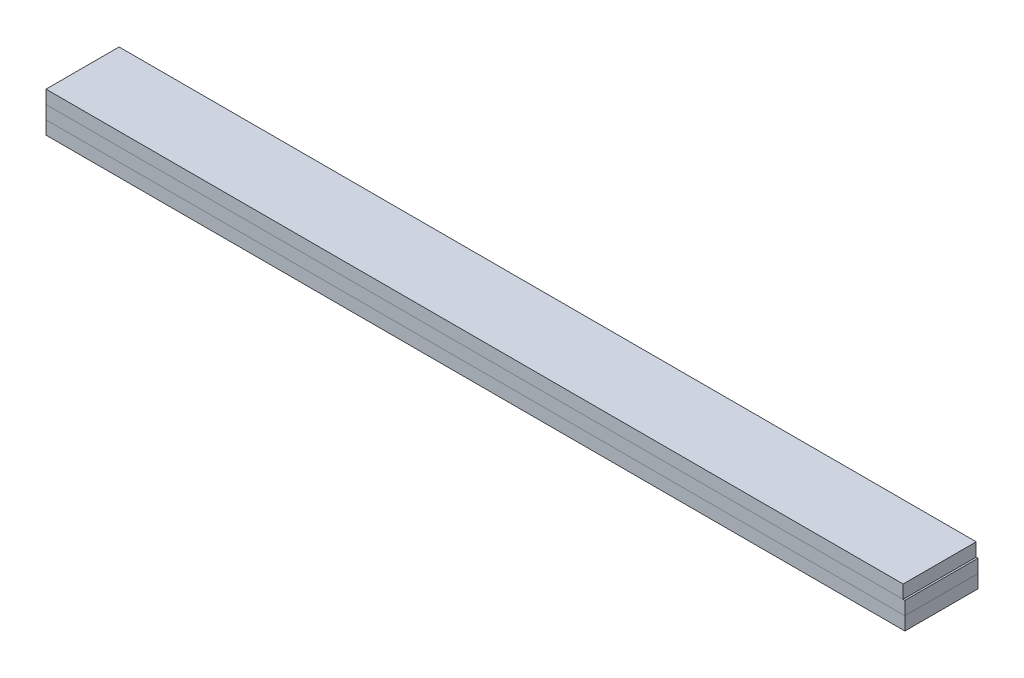
ISO-10303-21;
HEADER;
FILE_DESCRIPTION(('STEP AP214'),'2;1');
FILE_NAME('part.step','',(''),(''),'','','');
FILE_SCHEMA(('AUTOMOTIVE_DESIGN { 1 0 10303 214 1 1 1 1 }'));
ENDSEC;
DATA;
#1=APPLICATION_CONTEXT('core data for automotive mechanical design processes');
#2=APPLICATION_PROTOCOL_DEFINITION('international standard','automotive_design',2000,#1);
#3=PRODUCT_CONTEXT('',#1,'mechanical');
#4=PRODUCT('Part','Part','',(#3));
#5=PRODUCT_RELATED_PRODUCT_CATEGORY('part','',(#4));
#6=PRODUCT_DEFINITION_FORMATION('','',#4);
#7=PRODUCT_DEFINITION_CONTEXT('part definition',#1,'design');
#8=PRODUCT_DEFINITION('design','',#6,#7);
#9=PRODUCT_DEFINITION_SHAPE('','',#8);
#10=(LENGTH_UNIT() NAMED_UNIT(*) SI_UNIT(.MILLI.,.METRE.));
#11=(NAMED_UNIT(*) PLANE_ANGLE_UNIT() SI_UNIT($,.RADIAN.));
#12=(NAMED_UNIT(*) SI_UNIT($,.STERADIAN.) SOLID_ANGLE_UNIT());
#13=UNCERTAINTY_MEASURE_WITH_UNIT(LENGTH_MEASURE(1.E-05),#10,'distance_accuracy_value','');
#14=(GEOMETRIC_REPRESENTATION_CONTEXT(3) GLOBAL_UNCERTAINTY_ASSIGNED_CONTEXT((#13)) GLOBAL_UNIT_ASSIGNED_CONTEXT((#10,
#11,#12)) REPRESENTATION_CONTEXT('',''));
#15=CARTESIAN_POINT('',(0.,0.,0.));
#16=DIRECTION('',(0.,0.,1.));
#17=DIRECTION('',(1.,0.,0.));
#18=AXIS2_PLACEMENT_3D('',#15,#16,#17);
#19=CARTESIAN_POINT('',(-35.3670139383,3.,-3.10881053536226));
#20=DIRECTION('',(1.,0.,0.));
#21=DIRECTION('',(0.,0.,-1.));
#22=AXIS2_PLACEMENT_3D('',#19,#20,#21);
#23=PLANE('',#22);
#24=DIRECTION('',(0.,0.,1.));
#25=VECTOR('',#24,1.);
#26=CARTESIAN_POINT('',(-35.3670139383,2.,-3.10881053536226));
#27=LINE('',#26,#25);
#28=CARTESIAN_POINT('',(-35.3670139383,2.,-3.10881053536226));
#29=VERTEX_POINT('',#28);
#30=CARTESIAN_POINT('',(-35.3670139383,2.,2.39118946463774));
#31=VERTEX_POINT('',#30);
#32=EDGE_CURVE('E99',#29,#31,#27,.T.);
#33=ORIENTED_EDGE('',*,*,#32,.T.);
#34=DIRECTION('',(0.,-1.,0.));
#35=VECTOR('',#34,1.);
#36=CARTESIAN_POINT('',(-35.3670139383,3.,2.39118946463774));
#37=LINE('',#36,#35);
#38=CARTESIAN_POINT('',(-35.3670139383,3.,2.39118946463774));
#39=VERTEX_POINT('',#38);
#40=EDGE_CURVE('E12',#39,#31,#37,.T.);
#41=ORIENTED_EDGE('',*,*,#40,.F.);
#42=DIRECTION('',(0.,0.,1.));
#43=VECTOR('',#42,1.);
#44=CARTESIAN_POINT('',(-35.3670139383,3.,-3.10881053536226));
#45=LINE('',#44,#43);
#46=CARTESIAN_POINT('',(-35.3670139383,3.,-3.10881053536226));
#47=VERTEX_POINT('',#46);
#48=EDGE_CURVE('E93',#47,#39,#45,.T.);
#49=ORIENTED_EDGE('',*,*,#48,.F.);
#50=DIRECTION('',(0.,-1.,0.));
#51=VECTOR('',#50,1.);
#52=CARTESIAN_POINT('',(-35.3670139383,3.,-3.10881053536226));
#53=LINE('',#52,#51);
#54=EDGE_CURVE('E55',#47,#29,#53,.T.);
#55=ORIENTED_EDGE('',*,*,#54,.T.);
#56=EDGE_LOOP('',(#33,#41,#49,#55));
#57=FACE_BOUND('',#56,.T.);
#58=ADVANCED_FACE('F48',(#57),#23,.F.);
#59=CARTESIAN_POINT('',(-35.3670139383,3.,2.39118946463774));
#60=DIRECTION('',(0.,0.,-1.));
#61=DIRECTION('',(-1.,0.,0.));
#62=AXIS2_PLACEMENT_3D('',#59,#60,#61);
#63=PLANE('',#62);
#64=DIRECTION('',(1.,0.,0.));
#65=VECTOR('',#64,1.);
#66=CARTESIAN_POINT('',(-35.3670139383,2.,2.39118946463774));
#67=LINE('',#66,#65);
#68=CARTESIAN_POINT('',(29.1329860617,2.,2.39118946463774));
#69=VERTEX_POINT('',#68);
#70=EDGE_CURVE('E94',#31,#69,#67,.T.);
#71=ORIENTED_EDGE('',*,*,#70,.T.);
#72=DIRECTION('',(0.,1.,0.));
#73=VECTOR('',#72,1.);
#74=CARTESIAN_POINT('',(29.1329860617,2.,2.39118946463716));
#75=LINE('',#74,#73);
#76=CARTESIAN_POINT('',(29.1329860617,3.,2.39118946463716));
#77=VERTEX_POINT('',#76);
#78=EDGE_CURVE('E62',#69,#77,#75,.T.);
#79=ORIENTED_EDGE('',*,*,#78,.T.);
#80=DIRECTION('',(1.,0.,0.));
#81=VECTOR('',#80,1.);
#82=CARTESIAN_POINT('',(-35.3670139383,3.,2.39118946463774));
#83=LINE('',#82,#81);
#84=EDGE_CURVE('E107',#39,#77,#83,.T.);
#85=ORIENTED_EDGE('',*,*,#84,.F.);
#86=ORIENTED_EDGE('',*,*,#40,.T.);
#87=EDGE_LOOP('',(#71,#79,#85,#86));
#88=FACE_BOUND('',#87,.T.);
#89=ADVANCED_FACE('F116',(#88),#63,.F.);
#90=CARTESIAN_POINT('',(34.1499860616999,3.,-3.10881053536226));
#91=DIRECTION('',(0.,0.,1.));
#92=DIRECTION('',(1.,0.,0.));
#93=AXIS2_PLACEMENT_3D('',#90,#91,#92);
#94=PLANE('',#93);
#95=DIRECTION('',(-1.,0.,0.));
#96=VECTOR('',#95,1.);
#97=CARTESIAN_POINT('',(34.1499860616999,3.,-3.10881053536226));
#98=LINE('',#97,#96);
#99=CARTESIAN_POINT('',(29.1329860617,3.,-3.10881053536226));
#100=VERTEX_POINT('',#99);
#101=EDGE_CURVE('E71',#100,#47,#98,.T.);
#102=ORIENTED_EDGE('',*,*,#101,.F.);
#103=DIRECTION('',(0.,1.,0.));
#104=VECTOR('',#103,1.);
#105=CARTESIAN_POINT('',(29.1329860617,2.,-3.10881053536226));
#106=LINE('',#105,#104);
#107=CARTESIAN_POINT('',(29.1329860617,2.,-3.10881053536226));
#108=VERTEX_POINT('',#107);
#109=EDGE_CURVE('E90',#108,#100,#106,.T.);
#110=ORIENTED_EDGE('',*,*,#109,.F.);
#111=DIRECTION('',(-1.,0.,0.));
#112=VECTOR('',#111,1.);
#113=CARTESIAN_POINT('',(34.1499860616999,2.,-3.10881053536226));
#114=LINE('',#113,#112);
#115=EDGE_CURVE('E85',#108,#29,#114,.T.);
#116=ORIENTED_EDGE('',*,*,#115,.T.);
#117=ORIENTED_EDGE('',*,*,#54,.F.);
#118=EDGE_LOOP('',(#102,#110,#116,#117));
#119=FACE_BOUND('',#118,.T.);
#120=ADVANCED_FACE('F87',(#119),#94,.F.);
#121=CARTESIAN_POINT('',(0.,3.,0.));
#122=DIRECTION('',(0.,1.,0.));
#123=DIRECTION('',(0.,0.,1.));
#124=AXIS2_PLACEMENT_3D('',#121,#122,#123);
#125=PLANE('',#124);
#126=DIRECTION('',(0.,0.,1.));
#127=VECTOR('',#126,1.);
#128=CARTESIAN_POINT('',(29.1329860617,3.,2.39118946463716));
#129=LINE('',#128,#127);
#130=EDGE_CURVE('E113',#100,#77,#129,.T.);
#131=ORIENTED_EDGE('',*,*,#130,.F.);
#132=ORIENTED_EDGE('',*,*,#101,.T.);
#133=ORIENTED_EDGE('',*,*,#48,.T.);
#134=ORIENTED_EDGE('',*,*,#84,.T.);
#135=EDGE_LOOP('',(#131,#132,#133,#134));
#136=FACE_BOUND('',#135,.T.);
#137=ADVANCED_FACE('F118',(#136),#125,.T.);
#138=CARTESIAN_POINT('',(0.,2.,0.));
#139=DIRECTION('',(0.,1.,0.));
#140=DIRECTION('',(0.,0.,1.));
#141=AXIS2_PLACEMENT_3D('',#138,#139,#140);
#142=PLANE('',#141);
#143=ORIENTED_EDGE('',*,*,#115,.F.);
#144=DIRECTION('',(0.,0.,1.));
#145=VECTOR('',#144,1.);
#146=CARTESIAN_POINT('',(29.1329860617,2.,2.39118946463716));
#147=LINE('',#146,#145);
#148=EDGE_CURVE('E111',#108,#69,#147,.T.);
#149=ORIENTED_EDGE('',*,*,#148,.T.);
#150=ORIENTED_EDGE('',*,*,#70,.F.);
#151=ORIENTED_EDGE('',*,*,#32,.F.);
#152=EDGE_LOOP('',(#143,#149,#150,#151));
#153=FACE_BOUND('',#152,.T.);
#154=ADVANCED_FACE('F100',(#153),#142,.F.);
#155=CARTESIAN_POINT('',(29.1329860617,2.,2.39118946463716));
#156=DIRECTION('',(-1.,0.,0.));
#157=DIRECTION('',(0.,0.,1.));
#158=AXIS2_PLACEMENT_3D('',#155,#156,#157);
#159=PLANE('',#158);
#160=ORIENTED_EDGE('',*,*,#130,.T.);
#161=ORIENTED_EDGE('',*,*,#78,.F.);
#162=ORIENTED_EDGE('',*,*,#148,.F.);
#163=ORIENTED_EDGE('',*,*,#109,.T.);
#164=EDGE_LOOP('',(#160,#161,#162,#163));
#165=FACE_BOUND('',#164,.T.);
#166=ADVANCED_FACE('F126',(#165),#159,.F.);
#167=CLOSED_SHELL('',(#58,#89,#120,#137,#154,#166));
#168=MANIFOLD_SOLID_BREP('B2',#167);
#169=CARTESIAN_POINT('',(34.3329860617,2.,-3.10881053536226));
#170=DIRECTION('',(0.,0.,1.));
#171=DIRECTION('',(1.,0.,0.));
#172=AXIS2_PLACEMENT_3D('',#169,#170,#171);
#173=PLANE('',#172);
#174=DIRECTION('',(-1.,0.,0.));
#175=VECTOR('',#174,1.);
#176=CARTESIAN_POINT('',(34.3329860617,2.,-3.10881053536226));
#177=LINE('',#176,#175);
#178=CARTESIAN_POINT('',(29.2668356657233,2.,-3.10881053536226));
#179=VERTEX_POINT('',#178);
#180=CARTESIAN_POINT('',(-35.3670139383,2.,-3.10881053536226));
#181=VERTEX_POINT('',#180);
#182=EDGE_CURVE('E236',#179,#181,#177,.T.);
#183=ORIENTED_EDGE('',*,*,#182,.F.);
#184=DIRECTION('',(0.,1.,0.));
#185=VECTOR('',#184,1.);
#186=CARTESIAN_POINT('',(29.2668356657233,-18.,-3.10881053536226));
#187=LINE('',#186,#185);
#188=CARTESIAN_POINT('',(29.2668356657233,1.,-3.10881053536226));
#189=VERTEX_POINT('',#188);
#190=EDGE_CURVE('E243',#189,#179,#187,.T.);
#191=ORIENTED_EDGE('',*,*,#190,.F.);
#192=DIRECTION('',(-1.,0.,0.));
#193=VECTOR('',#192,1.);
#194=CARTESIAN_POINT('',(34.3329860617,1.,-3.10881053536226));
#195=LINE('',#194,#193);
#196=CARTESIAN_POINT('',(-35.3670139383,1.,-3.10881053536226));
#197=VERTEX_POINT('',#196);
#198=EDGE_CURVE('E228',#189,#197,#195,.T.);
#199=ORIENTED_EDGE('',*,*,#198,.T.);
#200=DIRECTION('',(0.,-1.,0.));
#201=VECTOR('',#200,1.);
#202=CARTESIAN_POINT('',(-35.3670139383,2.,-3.10881053536226));
#203=LINE('',#202,#201);
#204=EDGE_CURVE('E190',#181,#197,#203,.T.);
#205=ORIENTED_EDGE('',*,*,#204,.F.);
#206=EDGE_LOOP('',(#183,#191,#199,#205));
#207=FACE_BOUND('',#206,.T.);
#208=ADVANCED_FACE('F183',(#207),#173,.F.);
#209=CARTESIAN_POINT('',(-35.3670139383,2.,-3.10881053536226));
#210=DIRECTION('',(1.,0.,0.));
#211=DIRECTION('',(0.,0.,-1.));
#212=AXIS2_PLACEMENT_3D('',#209,#210,#211);
#213=PLANE('',#212);
#214=DIRECTION('',(0.,0.,1.));
#215=VECTOR('',#214,1.);
#216=CARTESIAN_POINT('',(-35.3670139383,1.,-3.10881053536226));
#217=LINE('',#216,#215);
#218=CARTESIAN_POINT('',(-35.3670139383,1.,2.39118946463774));
#219=VERTEX_POINT('',#218);
#220=EDGE_CURVE('E218',#197,#219,#217,.T.);
#221=ORIENTED_EDGE('',*,*,#220,.T.);
#222=DIRECTION('',(0.,-1.,0.));
#223=VECTOR('',#222,1.);
#224=CARTESIAN_POINT('',(-35.3670139383,2.,2.39118946463774));
#225=LINE('',#224,#223);
#226=CARTESIAN_POINT('',(-35.3670139383,2.,2.39118946463774));
#227=VERTEX_POINT('',#226);
#228=EDGE_CURVE('E221',#227,#219,#225,.T.);
#229=ORIENTED_EDGE('',*,*,#228,.F.);
#230=DIRECTION('',(0.,0.,1.));
#231=VECTOR('',#230,1.);
#232=CARTESIAN_POINT('',(-35.3670139383,2.,-3.10881053536226));
#233=LINE('',#232,#231);
#234=EDGE_CURVE('E205',#181,#227,#233,.T.);
#235=ORIENTED_EDGE('',*,*,#234,.F.);
#236=ORIENTED_EDGE('',*,*,#204,.T.);
#237=EDGE_LOOP('',(#221,#229,#235,#236));
#238=FACE_BOUND('',#237,.T.);
#239=ADVANCED_FACE('F220',(#238),#213,.F.);
#240=CARTESIAN_POINT('',(-35.3670139383,2.,2.39118946463774));
#241=DIRECTION('',(0.,0.,-1.));
#242=DIRECTION('',(-1.,0.,0.));
#243=AXIS2_PLACEMENT_3D('',#240,#241,#242);
#244=PLANE('',#243);
#245=DIRECTION('',(1.,0.,0.));
#246=VECTOR('',#245,1.);
#247=CARTESIAN_POINT('',(-35.3670139383,1.,2.39118946463774));
#248=LINE('',#247,#246);
#249=CARTESIAN_POINT('',(29.2668356657233,1.,2.39118946463774));
#250=VERTEX_POINT('',#249);
#251=EDGE_CURVE('E227',#219,#250,#248,.T.);
#252=ORIENTED_EDGE('',*,*,#251,.T.);
#253=DIRECTION('',(0.,1.,0.));
#254=VECTOR('',#253,1.);
#255=CARTESIAN_POINT('',(29.2668356657233,-18.,2.39118946463774));
#256=LINE('',#255,#254);
#257=CARTESIAN_POINT('',(29.2668356657233,2.,2.39118946463774));
#258=VERTEX_POINT('',#257);
#259=EDGE_CURVE('E197',#250,#258,#256,.T.);
#260=ORIENTED_EDGE('',*,*,#259,.T.);
#261=DIRECTION('',(1.,0.,0.));
#262=VECTOR('',#261,1.);
#263=CARTESIAN_POINT('',(-35.3670139383,2.,2.39118946463774));
#264=LINE('',#263,#262);
#265=EDGE_CURVE('E233',#227,#258,#264,.T.);
#266=ORIENTED_EDGE('',*,*,#265,.F.);
#267=ORIENTED_EDGE('',*,*,#228,.T.);
#268=EDGE_LOOP('',(#252,#260,#266,#267));
#269=FACE_BOUND('',#268,.T.);
#270=ADVANCED_FACE('F232',(#269),#244,.F.);
#271=CARTESIAN_POINT('',(0.,2.,0.));
#272=DIRECTION('',(0.,1.,0.));
#273=DIRECTION('',(0.,0.,1.));
#274=AXIS2_PLACEMENT_3D('',#271,#272,#273);
#275=PLANE('',#274);
#276=DIRECTION('',(0.,0.,1.));
#277=VECTOR('',#276,1.);
#278=CARTESIAN_POINT('',(29.2668356657233,2.,2.39118946463774));
#279=LINE('',#278,#277);
#280=EDGE_CURVE('E246',#179,#258,#279,.T.);
#281=ORIENTED_EDGE('',*,*,#280,.F.);
#282=ORIENTED_EDGE('',*,*,#182,.T.);
#283=ORIENTED_EDGE('',*,*,#234,.T.);
#284=ORIENTED_EDGE('',*,*,#265,.T.);
#285=EDGE_LOOP('',(#281,#282,#283,#284));
#286=FACE_BOUND('',#285,.T.);
#287=ADVANCED_FACE('F255',(#286),#275,.T.);
#288=CARTESIAN_POINT('',(0.,1.,0.));
#289=DIRECTION('',(0.,1.,0.));
#290=DIRECTION('',(0.,0.,1.));
#291=AXIS2_PLACEMENT_3D('',#288,#289,#290);
#292=PLANE('',#291);
#293=ORIENTED_EDGE('',*,*,#198,.F.);
#294=DIRECTION('',(0.,0.,1.));
#295=VECTOR('',#294,1.);
#296=CARTESIAN_POINT('',(29.2668356657233,1.,0.));
#297=LINE('',#296,#295);
#298=EDGE_CURVE('E46',#189,#250,#297,.T.);
#299=ORIENTED_EDGE('',*,*,#298,.T.);
#300=ORIENTED_EDGE('',*,*,#251,.F.);
#301=ORIENTED_EDGE('',*,*,#220,.F.);
#302=EDGE_LOOP('',(#293,#299,#300,#301));
#303=FACE_BOUND('',#302,.T.);
#304=ADVANCED_FACE('F235',(#303),#292,.F.);
#305=CARTESIAN_POINT('',(29.2668356657233,-18.,2.39118946463774));
#306=DIRECTION('',(-1.,0.,0.));
#307=DIRECTION('',(0.,0.,1.));
#308=AXIS2_PLACEMENT_3D('',#305,#306,#307);
#309=PLANE('',#308);
#310=ORIENTED_EDGE('',*,*,#190,.T.);
#311=ORIENTED_EDGE('',*,*,#280,.T.);
#312=ORIENTED_EDGE('',*,*,#259,.F.);
#313=ORIENTED_EDGE('',*,*,#298,.F.);
#314=EDGE_LOOP('',(#310,#311,#312,#313));
#315=FACE_BOUND('',#314,.T.);
#316=ADVANCED_FACE('F250',(#315),#309,.F.);
#317=CLOSED_SHELL('',(#208,#239,#270,#287,#304,#316));
#318=MANIFOLD_SOLID_BREP('B6',#317);
#319=CARTESIAN_POINT('',(34.3329860617,1.,-3.10881053536226));
#320=DIRECTION('',(0.,0.,1.));
#321=DIRECTION('',(1.,0.,0.));
#322=AXIS2_PLACEMENT_3D('',#319,#320,#321);
#323=PLANE('',#322);
#324=DIRECTION('',(-1.,0.,0.));
#325=VECTOR('',#324,1.);
#326=CARTESIAN_POINT('',(34.3329860617,1.,-3.10881053536226));
#327=LINE('',#326,#325);
#328=CARTESIAN_POINT('',(29.2668356657233,1.,-3.10881053536226));
#329=VERTEX_POINT('',#328);
#330=CARTESIAN_POINT('',(-35.3670139383,1.,-3.10881053536226));
#331=VERTEX_POINT('',#330);
#332=EDGE_CURVE('E362',#329,#331,#327,.T.);
#333=ORIENTED_EDGE('',*,*,#332,.F.);
#334=DIRECTION('',(0.,1.,0.));
#335=VECTOR('',#334,1.);
#336=CARTESIAN_POINT('',(29.2668356657233,-18.,-3.10881053536226));
#337=LINE('',#336,#335);
#338=CARTESIAN_POINT('',(29.2668356657233,0.,-3.10881053536226));
#339=VERTEX_POINT('',#338);
#340=EDGE_CURVE('E371',#339,#329,#337,.T.);
#341=ORIENTED_EDGE('',*,*,#340,.F.);
#342=DIRECTION('',(-1.,0.,0.));
#343=VECTOR('',#342,1.);
#344=CARTESIAN_POINT('',(34.3329860617,0.,-3.10881053536226));
#345=LINE('',#344,#343);
#346=CARTESIAN_POINT('',(-35.3670139383,0.,-3.10881053536226));
#347=VERTEX_POINT('',#346);
#348=EDGE_CURVE('E354',#339,#347,#345,.T.);
#349=ORIENTED_EDGE('',*,*,#348,.T.);
#350=DIRECTION('',(0.,-1.,0.));
#351=VECTOR('',#350,1.);
#352=CARTESIAN_POINT('',(-35.3670139383,1.,-3.10881053536226));
#353=LINE('',#352,#351);
#354=EDGE_CURVE('E316',#331,#347,#353,.T.);
#355=ORIENTED_EDGE('',*,*,#354,.F.);
#356=EDGE_LOOP('',(#333,#341,#349,#355));
#357=FACE_BOUND('',#356,.T.);
#358=ADVANCED_FACE('F309',(#357),#323,.F.);
#359=CARTESIAN_POINT('',(-35.3670139383,1.,-3.10881053536226));
#360=DIRECTION('',(1.,0.,0.));
#361=DIRECTION('',(0.,0.,-1.));
#362=AXIS2_PLACEMENT_3D('',#359,#360,#361);
#363=PLANE('',#362);
#364=DIRECTION('',(0.,0.,1.));
#365=VECTOR('',#364,1.);
#366=CARTESIAN_POINT('',(-35.3670139383,0.,-3.10881053536226));
#367=LINE('',#366,#365);
#368=CARTESIAN_POINT('',(-35.3670139383,0.,2.39118946463774));
#369=VERTEX_POINT('',#368);
#370=EDGE_CURVE('E344',#347,#369,#367,.T.);
#371=ORIENTED_EDGE('',*,*,#370,.T.);
#372=DIRECTION('',(0.,-1.,0.));
#373=VECTOR('',#372,1.);
#374=CARTESIAN_POINT('',(-35.3670139383,1.,2.39118946463774));
#375=LINE('',#374,#373);
#376=CARTESIAN_POINT('',(-35.3670139383,1.,2.39118946463774));
#377=VERTEX_POINT('',#376);
#378=EDGE_CURVE('E347',#377,#369,#375,.T.);
#379=ORIENTED_EDGE('',*,*,#378,.F.);
#380=DIRECTION('',(0.,0.,1.));
#381=VECTOR('',#380,1.);
#382=CARTESIAN_POINT('',(-35.3670139383,1.,-3.10881053536226));
#383=LINE('',#382,#381);
#384=EDGE_CURVE('E331',#331,#377,#383,.T.);
#385=ORIENTED_EDGE('',*,*,#384,.F.);
#386=ORIENTED_EDGE('',*,*,#354,.T.);
#387=EDGE_LOOP('',(#371,#379,#385,#386));
#388=FACE_BOUND('',#387,.T.);
#389=ADVANCED_FACE('F346',(#388),#363,.F.);
#390=CARTESIAN_POINT('',(-35.3670139383,1.,2.39118946463774));
#391=DIRECTION('',(0.,0.,-1.));
#392=DIRECTION('',(-1.,0.,0.));
#393=AXIS2_PLACEMENT_3D('',#390,#391,#392);
#394=PLANE('',#393);
#395=DIRECTION('',(1.,0.,0.));
#396=VECTOR('',#395,1.);
#397=CARTESIAN_POINT('',(-35.3670139383,0.,2.39118946463774));
#398=LINE('',#397,#396);
#399=CARTESIAN_POINT('',(29.2668356657233,0.,2.39118946463774));
#400=VERTEX_POINT('',#399);
#401=EDGE_CURVE('E353',#369,#400,#398,.T.);
#402=ORIENTED_EDGE('',*,*,#401,.T.);
#403=DIRECTION('',(0.,1.,0.));
#404=VECTOR('',#403,1.);
#405=CARTESIAN_POINT('',(29.2668356657233,-18.,2.39118946463774));
#406=LINE('',#405,#404);
#407=CARTESIAN_POINT('',(29.2668356657233,1.,2.39118946463774));
#408=VERTEX_POINT('',#407);
#409=EDGE_CURVE('E323',#400,#408,#406,.T.);
#410=ORIENTED_EDGE('',*,*,#409,.T.);
#411=DIRECTION('',(1.,0.,0.));
#412=VECTOR('',#411,1.);
#413=CARTESIAN_POINT('',(-35.3670139383,1.,2.39118946463774));
#414=LINE('',#413,#412);
#415=EDGE_CURVE('E359',#377,#408,#414,.T.);
#416=ORIENTED_EDGE('',*,*,#415,.F.);
#417=ORIENTED_EDGE('',*,*,#378,.T.);
#418=EDGE_LOOP('',(#402,#410,#416,#417));
#419=FACE_BOUND('',#418,.T.);
#420=ADVANCED_FACE('F358',(#419),#394,.F.);
#421=CARTESIAN_POINT('',(0.,1.,0.));
#422=DIRECTION('',(0.,1.,0.));
#423=DIRECTION('',(0.,0.,1.));
#424=AXIS2_PLACEMENT_3D('',#421,#422,#423);
#425=PLANE('',#424);
#426=DIRECTION('',(0.,0.,1.));
#427=VECTOR('',#426,1.);
#428=CARTESIAN_POINT('',(29.2668356657233,1.,0.));
#429=LINE('',#428,#427);
#430=EDGE_CURVE('E367',#329,#408,#429,.T.);
#431=ORIENTED_EDGE('',*,*,#430,.F.);
#432=ORIENTED_EDGE('',*,*,#332,.T.);
#433=ORIENTED_EDGE('',*,*,#384,.T.);
#434=ORIENTED_EDGE('',*,*,#415,.T.);
#435=EDGE_LOOP('',(#431,#432,#433,#434));
#436=FACE_BOUND('',#435,.T.);
#437=ADVANCED_FACE('F376',(#436),#425,.T.);
#438=CARTESIAN_POINT('',(0.,0.,0.));
#439=DIRECTION('',(0.,1.,0.));
#440=DIRECTION('',(0.,0.,1.));
#441=AXIS2_PLACEMENT_3D('',#438,#439,#440);
#442=PLANE('',#441);
#443=ORIENTED_EDGE('',*,*,#348,.F.);
#444=DIRECTION('',(0.,0.,1.));
#445=VECTOR('',#444,1.);
#446=CARTESIAN_POINT('',(29.2668356657233,0.,0.));
#447=LINE('',#446,#445);
#448=EDGE_CURVE('E181',#339,#400,#447,.T.);
#449=ORIENTED_EDGE('',*,*,#448,.T.);
#450=ORIENTED_EDGE('',*,*,#401,.F.);
#451=ORIENTED_EDGE('',*,*,#370,.F.);
#452=EDGE_LOOP('',(#443,#449,#450,#451));
#453=FACE_BOUND('',#452,.T.);
#454=ADVANCED_FACE('F361',(#453),#442,.F.);
#455=CARTESIAN_POINT('',(29.2668356657233,-18.,2.39118946463774));
#456=DIRECTION('',(-1.,0.,0.));
#457=DIRECTION('',(0.,0.,1.));
#458=AXIS2_PLACEMENT_3D('',#455,#456,#457);
#459=PLANE('',#458);
#460=ORIENTED_EDGE('',*,*,#430,.T.);
#461=ORIENTED_EDGE('',*,*,#409,.F.);
#462=ORIENTED_EDGE('',*,*,#448,.F.);
#463=ORIENTED_EDGE('',*,*,#340,.T.);
#464=EDGE_LOOP('',(#460,#461,#462,#463));
#465=FACE_BOUND('',#464,.T.);
#466=ADVANCED_FACE('F383',(#465),#459,.F.);
#467=CLOSED_SHELL('',(#358,#389,#420,#437,#454,#466));
#468=MANIFOLD_SOLID_BREP('B40',#467);
#469=ADVANCED_BREP_SHAPE_REPRESENTATION('',(#18,#168,#318,#468),#14);
#470=SHAPE_DEFINITION_REPRESENTATION(#9,#469);
ENDSEC;
END-ISO-10303-21;
